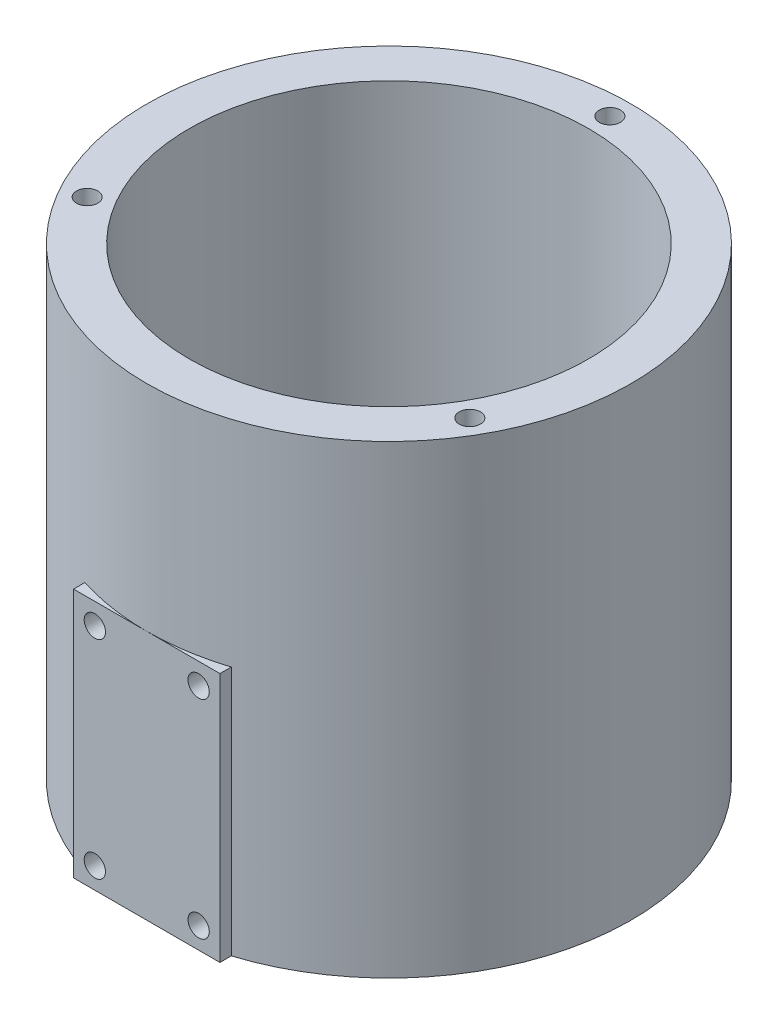
ISO-10303-21;
HEADER;
FILE_DESCRIPTION(('STEP AP214'),'2;1');
FILE_NAME('part.step','',(''),(''),'','','');
FILE_SCHEMA(('AUTOMOTIVE_DESIGN { 1 0 10303 214 1 1 1 1 }'));
ENDSEC;
DATA;
#1=APPLICATION_CONTEXT('core data for automotive mechanical design processes');
#2=APPLICATION_PROTOCOL_DEFINITION('international standard','automotive_design',2000,#1);
#3=PRODUCT_CONTEXT('',#1,'mechanical');
#4=PRODUCT('Part','Part','',(#3));
#5=PRODUCT_RELATED_PRODUCT_CATEGORY('part','',(#4));
#6=PRODUCT_DEFINITION_FORMATION('','',#4);
#7=PRODUCT_DEFINITION_CONTEXT('part definition',#1,'design');
#8=PRODUCT_DEFINITION('design','',#6,#7);
#9=PRODUCT_DEFINITION_SHAPE('','',#8);
#10=(LENGTH_UNIT() NAMED_UNIT(*) SI_UNIT(.MILLI.,.METRE.));
#11=(NAMED_UNIT(*) PLANE_ANGLE_UNIT() SI_UNIT($,.RADIAN.));
#12=(NAMED_UNIT(*) SI_UNIT($,.STERADIAN.) SOLID_ANGLE_UNIT());
#13=UNCERTAINTY_MEASURE_WITH_UNIT(LENGTH_MEASURE(1.E-05),#10,'distance_accuracy_value','');
#14=(GEOMETRIC_REPRESENTATION_CONTEXT(3) GLOBAL_UNCERTAINTY_ASSIGNED_CONTEXT((#13)) GLOBAL_UNIT_ASSIGNED_CONTEXT((#10,
#11,#12)) REPRESENTATION_CONTEXT('',''));
#15=CARTESIAN_POINT('',(0.,0.,0.));
#16=DIRECTION('',(0.,0.,1.));
#17=DIRECTION('',(1.,0.,0.));
#18=AXIS2_PLACEMENT_3D('',#15,#16,#17);
#19=CARTESIAN_POINT('',(0.,4.,0.));
#20=DIRECTION('',(0.,1.,0.));
#21=DIRECTION('',(0.,0.,1.));
#22=AXIS2_PLACEMENT_3D('',#19,#20,#21);
#23=PLANE('',#22);
#24=CARTESIAN_POINT('',(0.,4.,0.));
#25=DIRECTION('',(0.,1.,0.));
#26=DIRECTION('',(0.,0.,1.));
#27=AXIS2_PLACEMENT_3D('',#24,#25,#26);
#28=CIRCLE('',#27,33.5);
#29=CARTESIAN_POINT('',(0.,4.,33.5));
#30=VERTEX_POINT('',#29);
#31=EDGE_CURVE('E52',#30,#30,#28,.T.);
#32=ORIENTED_EDGE('',*,*,#31,.F.);
#33=EDGE_LOOP('',(#32));
#34=FACE_BOUND('',#33,.T.);
#35=CARTESIAN_POINT('',(0.,4.,0.));
#36=DIRECTION('',(0.,1.,0.));
#37=DIRECTION('',(0.,0.,1.));
#38=AXIS2_PLACEMENT_3D('',#35,#36,#37);
#39=CIRCLE('',#38,37.5);
#40=CARTESIAN_POINT('',(0.,4.,37.5));
#41=VERTEX_POINT('',#40);
#42=EDGE_CURVE('E161',#41,#41,#39,.T.);
#43=ORIENTED_EDGE('',*,*,#42,.T.);
#44=EDGE_LOOP('',(#43));
#45=FACE_BOUND('',#44,.T.);
#46=ADVANCED_FACE('F43',(#34,#45),#23,.T.);
#47=CARTESIAN_POINT('',(0.,0.,0.));
#48=DIRECTION('',(0.,1.,0.));
#49=DIRECTION('',(0.,0.,1.));
#50=AXIS2_PLACEMENT_3D('',#47,#48,#49);
#51=PLANE('',#50);
#52=CARTESIAN_POINT('',(0.,0.,0.));
#53=DIRECTION('',(0.,1.,0.));
#54=DIRECTION('',(0.,0.,1.));
#55=AXIS2_PLACEMENT_3D('',#52,#53,#54);
#56=CIRCLE('',#55,45.5);
#57=CARTESIAN_POINT('',(13.75,0.,43.3726584382373));
#58=VERTEX_POINT('',#57);
#59=CARTESIAN_POINT('',(-13.75,0.,43.3726584382373));
#60=VERTEX_POINT('',#59);
#61=EDGE_CURVE('E11',#58,#60,#56,.T.);
#62=ORIENTED_EDGE('',*,*,#61,.F.);
#63=DIRECTION('',(0.,0.,1.));
#64=VECTOR('',#63,1.);
#65=CARTESIAN_POINT('',(13.75,0.,-45.502));
#66=LINE('',#65,#64);
#67=CARTESIAN_POINT('',(13.75,0.,45.5));
#68=VERTEX_POINT('',#67);
#69=EDGE_CURVE('E105',#58,#68,#66,.T.);
#70=ORIENTED_EDGE('',*,*,#69,.T.);
#71=DIRECTION('',(1.,0.,0.));
#72=VECTOR('',#71,1.);
#73=CARTESIAN_POINT('',(-13.75,0.,45.5));
#74=LINE('',#73,#72);
#75=CARTESIAN_POINT('',(-13.75,0.,45.5));
#76=VERTEX_POINT('',#75);
#77=EDGE_CURVE('E131',#76,#68,#74,.T.);
#78=ORIENTED_EDGE('',*,*,#77,.F.);
#79=DIRECTION('',(0.,0.,1.));
#80=VECTOR('',#79,1.);
#81=CARTESIAN_POINT('',(-13.75,0.,-45.502));
#82=LINE('',#81,#80);
#83=EDGE_CURVE('E114',#60,#76,#82,.T.);
#84=ORIENTED_EDGE('',*,*,#83,.F.);
#85=EDGE_LOOP('',(#62,#70,#78,#84));
#86=FACE_BOUND('',#85,.T.);
#87=CARTESIAN_POINT('',(0.,0.,0.));
#88=DIRECTION('',(0.,1.,0.));
#89=DIRECTION('',(0.,0.,1.));
#90=AXIS2_PLACEMENT_3D('',#87,#88,#89);
#91=CIRCLE('',#90,33.5);
#92=CARTESIAN_POINT('',(0.,0.,33.5));
#93=VERTEX_POINT('',#92);
#94=EDGE_CURVE('E176',#93,#93,#91,.T.);
#95=ORIENTED_EDGE('',*,*,#94,.T.);
#96=EDGE_LOOP('',(#95));
#97=FACE_BOUND('',#96,.T.);
#98=ADVANCED_FACE('F183',(#86,#97),#51,.F.);
#99=CARTESIAN_POINT('',(0.,4.,0.));
#100=DIRECTION('',(0.,-1.,0.));
#101=DIRECTION('',(0.,0.,-1.));
#102=AXIS2_PLACEMENT_3D('',#99,#100,#101);
#103=CYLINDRICAL_SURFACE('',#102,45.5);
#104=ORIENTED_EDGE('',*,*,#61,.T.);
#105=DIRECTION('',(0.,-1.,0.));
#106=VECTOR('',#105,1.);
#107=CARTESIAN_POINT('',(-13.75,4.,43.3726584382373));
#108=LINE('',#107,#106);
#109=CARTESIAN_POINT('',(-13.75,47.,43.3726584382373));
#110=VERTEX_POINT('',#109);
#111=EDGE_CURVE('E58',#110,#60,#108,.T.);
#112=ORIENTED_EDGE('',*,*,#111,.F.);
#113=CARTESIAN_POINT('',(0.,47.,0.));
#114=DIRECTION('',(0.,1.,0.));
#115=DIRECTION('',(0.,0.,1.));
#116=AXIS2_PLACEMENT_3D('',#113,#114,#115);
#117=CIRCLE('',#116,45.5);
#118=CARTESIAN_POINT('',(0.,47.,45.5));
#119=VERTEX_POINT('',#118);
#120=EDGE_CURVE('E108',#119,#110,#117,.F.);
#121=ORIENTED_EDGE('',*,*,#120,.F.);
#122=CARTESIAN_POINT('',(0.,47.,0.));
#123=DIRECTION('',(0.,1.,0.));
#124=DIRECTION('',(0.,0.,1.));
#125=AXIS2_PLACEMENT_3D('',#122,#123,#124);
#126=CIRCLE('',#125,45.5);
#127=CARTESIAN_POINT('',(13.75,47.,43.3726584382373));
#128=VERTEX_POINT('',#127);
#129=EDGE_CURVE('E101',#128,#119,#126,.F.);
#130=ORIENTED_EDGE('',*,*,#129,.F.);
#131=DIRECTION('',(0.,-1.,0.));
#132=VECTOR('',#131,1.);
#133=CARTESIAN_POINT('',(13.75,4.,43.3726584382373));
#134=LINE('',#133,#132);
#135=EDGE_CURVE('E106',#58,#128,#134,.F.);
#136=ORIENTED_EDGE('',*,*,#135,.F.);
#137=EDGE_LOOP('',(#104,#112,#121,#130,#136));
#138=FACE_BOUND('',#137,.T.);
#139=CARTESIAN_POINT('',(0.,87.3,0.));
#140=DIRECTION('',(0.,1.,0.));
#141=DIRECTION('',(0.,0.,1.));
#142=AXIS2_PLACEMENT_3D('',#139,#140,#141);
#143=CIRCLE('',#142,45.5);
#144=CARTESIAN_POINT('',(0.,87.3,45.5));
#145=VERTEX_POINT('',#144);
#146=EDGE_CURVE('E169',#145,#145,#143,.T.);
#147=ORIENTED_EDGE('',*,*,#146,.F.);
#148=EDGE_LOOP('',(#147));
#149=FACE_BOUND('',#148,.T.);
#150=ADVANCED_FACE('F45',(#138,#149),#103,.T.);
#151=CARTESIAN_POINT('',(0.,4.,0.));
#152=DIRECTION('',(0.,-1.,0.));
#153=DIRECTION('',(0.,0.,-1.));
#154=AXIS2_PLACEMENT_3D('',#151,#152,#153);
#155=CYLINDRICAL_SURFACE('',#154,33.5);
#156=ORIENTED_EDGE('',*,*,#31,.T.);
#157=EDGE_LOOP('',(#156));
#158=FACE_BOUND('',#157,.T.);
#159=ORIENTED_EDGE('',*,*,#94,.F.);
#160=EDGE_LOOP('',(#159));
#161=FACE_BOUND('',#160,.T.);
#162=ADVANCED_FACE('F185',(#158,#161),#155,.F.);
#163=CARTESIAN_POINT('',(0.,87.3,0.));
#164=DIRECTION('',(0.,1.,0.));
#165=DIRECTION('',(0.,0.,1.));
#166=AXIS2_PLACEMENT_3D('',#163,#164,#165);
#167=PLANE('',#166);
#168=CARTESIAN_POINT('',(-35.9400542570541,87.3,20.7500000000002));
#169=DIRECTION('',(0.,1.,0.));
#170=DIRECTION('',(0.866025403784436,0.,-0.500000000000004));
#171=AXIS2_PLACEMENT_3D('',#168,#169,#170);
#172=CIRCLE('',#171,2.);
#173=CARTESIAN_POINT('',(-34.2080034494852,87.3,19.7500000000002));
#174=VERTEX_POINT('',#173);
#175=EDGE_CURVE('E146',#174,#174,#172,.T.);
#176=ORIENTED_EDGE('',*,*,#175,.F.);
#177=EDGE_LOOP('',(#176));
#178=FACE_BOUND('',#177,.T.);
#179=CARTESIAN_POINT('',(35.9400542570544,87.3,20.7499999999997));
#180=DIRECTION('',(0.,1.,0.));
#181=DIRECTION('',(-0.866025403784443,0.,-0.499999999999992));
#182=AXIS2_PLACEMENT_3D('',#179,#180,#181);
#183=CIRCLE('',#182,2.);
#184=CARTESIAN_POINT('',(34.2080034494855,87.3,19.7499999999997));
#185=VERTEX_POINT('',#184);
#186=EDGE_CURVE('E136',#185,#185,#183,.T.);
#187=ORIENTED_EDGE('',*,*,#186,.F.);
#188=EDGE_LOOP('',(#187));
#189=FACE_BOUND('',#188,.T.);
#190=CARTESIAN_POINT('',(0.,87.3,-41.5));
#191=DIRECTION('',(0.,1.,0.));
#192=DIRECTION('',(0.,0.,1.));
#193=AXIS2_PLACEMENT_3D('',#190,#191,#192);
#194=CIRCLE('',#193,2.);
#195=CARTESIAN_POINT('',(0.,87.3,-39.5));
#196=VERTEX_POINT('',#195);
#197=EDGE_CURVE('E145',#196,#196,#194,.T.);
#198=ORIENTED_EDGE('',*,*,#197,.F.);
#199=EDGE_LOOP('',(#198));
#200=FACE_BOUND('',#199,.T.);
#201=ORIENTED_EDGE('',*,*,#146,.T.);
#202=EDGE_LOOP('',(#201));
#203=FACE_BOUND('',#202,.T.);
#204=CARTESIAN_POINT('',(0.,87.3,0.));
#205=DIRECTION('',(0.,1.,0.));
#206=DIRECTION('',(0.,0.,1.));
#207=AXIS2_PLACEMENT_3D('',#204,#205,#206);
#208=CIRCLE('',#207,37.5);
#209=CARTESIAN_POINT('',(0.,87.3,37.5));
#210=VERTEX_POINT('',#209);
#211=EDGE_CURVE('E165',#210,#210,#208,.T.);
#212=ORIENTED_EDGE('',*,*,#211,.F.);
#213=EDGE_LOOP('',(#212));
#214=FACE_BOUND('',#213,.T.);
#215=ADVANCED_FACE('F187',(#178,#189,#200,#203,#214),#167,.T.);
#216=CARTESIAN_POINT('',(0.,87.3,0.));
#217=DIRECTION('',(0.,-1.,0.));
#218=DIRECTION('',(0.,0.,-1.));
#219=AXIS2_PLACEMENT_3D('',#216,#217,#218);
#220=CYLINDRICAL_SURFACE('',#219,37.5);
#221=ORIENTED_EDGE('',*,*,#211,.T.);
#222=EDGE_LOOP('',(#221));
#223=FACE_BOUND('',#222,.T.);
#224=ORIENTED_EDGE('',*,*,#42,.F.);
#225=EDGE_LOOP('',(#224));
#226=FACE_BOUND('',#225,.T.);
#227=ADVANCED_FACE('F194',(#223,#226),#220,.F.);
#228=CARTESIAN_POINT('',(0.,81.3,-41.5));
#229=DIRECTION('',(0.,1.,0.));
#230=DIRECTION('',(0.,0.,1.));
#231=AXIS2_PLACEMENT_3D('',#228,#229,#230);
#232=CYLINDRICAL_SURFACE('',#231,2.);
#233=CARTESIAN_POINT('',(0.,81.3,-41.5));
#234=DIRECTION('',(0.,1.,0.));
#235=DIRECTION('',(0.,0.,1.));
#236=AXIS2_PLACEMENT_3D('',#233,#234,#235);
#237=CIRCLE('',#236,2.);
#238=CARTESIAN_POINT('',(0.,81.3,-39.5));
#239=VERTEX_POINT('',#238);
#240=EDGE_CURVE('E157',#239,#239,#237,.T.);
#241=ORIENTED_EDGE('',*,*,#240,.F.);
#242=EDGE_LOOP('',(#241));
#243=FACE_BOUND('',#242,.T.);
#244=ORIENTED_EDGE('',*,*,#197,.T.);
#245=EDGE_LOOP('',(#244));
#246=FACE_BOUND('',#245,.T.);
#247=ADVANCED_FACE('F209',(#243,#246),#232,.F.);
#248=CARTESIAN_POINT('',(0.,81.3,-41.5));
#249=DIRECTION('',(0.,1.,0.));
#250=DIRECTION('',(0.,0.,1.));
#251=AXIS2_PLACEMENT_3D('',#248,#249,#250);
#252=PLANE('',#251);
#253=ORIENTED_EDGE('',*,*,#240,.T.);
#254=EDGE_LOOP('',(#253));
#255=FACE_BOUND('',#254,.T.);
#256=ADVANCED_FACE('F215',(#255),#252,.T.);
#257=CARTESIAN_POINT('',(35.9400542570544,81.3,20.7499999999997));
#258=DIRECTION('',(0.,1.,0.));
#259=DIRECTION('',(0.,0.,1.));
#260=AXIS2_PLACEMENT_3D('',#257,#258,#259);
#261=CYLINDRICAL_SURFACE('',#260,2.);
#262=CARTESIAN_POINT('',(35.9400542570544,81.3,20.7499999999997));
#263=DIRECTION('',(0.,1.,0.));
#264=DIRECTION('',(-0.866025403784443,0.,-0.499999999999992));
#265=AXIS2_PLACEMENT_3D('',#262,#263,#264);
#266=CIRCLE('',#265,2.);
#267=CARTESIAN_POINT('',(34.2080034494855,81.3,19.7499999999997));
#268=VERTEX_POINT('',#267);
#269=EDGE_CURVE('E150',#268,#268,#266,.T.);
#270=ORIENTED_EDGE('',*,*,#269,.F.);
#271=EDGE_LOOP('',(#270));
#272=FACE_BOUND('',#271,.T.);
#273=ORIENTED_EDGE('',*,*,#186,.T.);
#274=EDGE_LOOP('',(#273));
#275=FACE_BOUND('',#274,.T.);
#276=ADVANCED_FACE('F221',(#272,#275),#261,.F.);
#277=CARTESIAN_POINT('',(35.9400542570544,81.3,20.7499999999997));
#278=DIRECTION('',(0.,1.,0.));
#279=DIRECTION('',(-0.866025403784443,0.,-0.499999999999992));
#280=AXIS2_PLACEMENT_3D('',#277,#278,#279);
#281=PLANE('',#280);
#282=ORIENTED_EDGE('',*,*,#269,.T.);
#283=EDGE_LOOP('',(#282));
#284=FACE_BOUND('',#283,.T.);
#285=ADVANCED_FACE('F225',(#284),#281,.T.);
#286=CARTESIAN_POINT('',(-35.9400542570541,81.3,20.7500000000002));
#287=DIRECTION('',(0.,1.,0.));
#288=DIRECTION('',(0.,0.,1.));
#289=AXIS2_PLACEMENT_3D('',#286,#287,#288);
#290=CYLINDRICAL_SURFACE('',#289,2.);
#291=CARTESIAN_POINT('',(-35.9400542570541,81.3,20.7500000000002));
#292=DIRECTION('',(0.,1.,0.));
#293=DIRECTION('',(0.866025403784436,0.,-0.500000000000004));
#294=AXIS2_PLACEMENT_3D('',#291,#292,#293);
#295=CIRCLE('',#294,2.);
#296=CARTESIAN_POINT('',(-34.2080034494852,81.3,19.7500000000002));
#297=VERTEX_POINT('',#296);
#298=EDGE_CURVE('E141',#297,#297,#295,.T.);
#299=ORIENTED_EDGE('',*,*,#298,.F.);
#300=EDGE_LOOP('',(#299));
#301=FACE_BOUND('',#300,.T.);
#302=ORIENTED_EDGE('',*,*,#175,.T.);
#303=EDGE_LOOP('',(#302));
#304=FACE_BOUND('',#303,.T.);
#305=ADVANCED_FACE('F229',(#301,#304),#290,.F.);
#306=CARTESIAN_POINT('',(-35.9400542570541,81.3,20.7500000000002));
#307=DIRECTION('',(0.,1.,0.));
#308=DIRECTION('',(0.866025403784436,0.,-0.500000000000004));
#309=AXIS2_PLACEMENT_3D('',#306,#307,#308);
#310=PLANE('',#309);
#311=ORIENTED_EDGE('',*,*,#298,.T.);
#312=EDGE_LOOP('',(#311));
#313=FACE_BOUND('',#312,.T.);
#314=ADVANCED_FACE('F233',(#313),#310,.T.);
#315=CARTESIAN_POINT('',(13.75,47.,-45.502));
#316=DIRECTION('',(0.,1.,0.));
#317=DIRECTION('',(0.,0.,1.));
#318=AXIS2_PLACEMENT_3D('',#315,#316,#317);
#319=PLANE('',#318);
#320=DIRECTION('',(0.,0.,1.));
#321=VECTOR('',#320,1.);
#322=CARTESIAN_POINT('',(13.75,47.,-45.502));
#323=LINE('',#322,#321);
#324=CARTESIAN_POINT('',(13.75,47.,45.5));
#325=VERTEX_POINT('',#324);
#326=EDGE_CURVE('E99',#128,#325,#323,.T.);
#327=ORIENTED_EDGE('',*,*,#326,.F.);
#328=ORIENTED_EDGE('',*,*,#129,.T.);
#329=DIRECTION('',(-1.,0.,0.));
#330=VECTOR('',#329,1.);
#331=CARTESIAN_POINT('',(13.75,47.,45.5));
#332=LINE('',#331,#330);
#333=EDGE_CURVE('E86',#325,#119,#332,.T.);
#334=ORIENTED_EDGE('',*,*,#333,.F.);
#335=EDGE_LOOP('',(#327,#328,#334));
#336=FACE_BOUND('',#335,.T.);
#337=ADVANCED_FACE('F102',(#336),#319,.T.);
#338=CARTESIAN_POINT('',(13.75,0.,-45.502));
#339=DIRECTION('',(1.,0.,0.));
#340=DIRECTION('',(0.,0.,-1.));
#341=AXIS2_PLACEMENT_3D('',#338,#339,#340);
#342=PLANE('',#341);
#343=ORIENTED_EDGE('',*,*,#69,.F.);
#344=ORIENTED_EDGE('',*,*,#135,.T.);
#345=ORIENTED_EDGE('',*,*,#326,.T.);
#346=DIRECTION('',(0.,1.,0.));
#347=VECTOR('',#346,1.);
#348=CARTESIAN_POINT('',(13.75,0.,45.5));
#349=LINE('',#348,#347);
#350=EDGE_CURVE('E95',#68,#325,#349,.T.);
#351=ORIENTED_EDGE('',*,*,#350,.F.);
#352=EDGE_LOOP('',(#343,#344,#345,#351));
#353=FACE_BOUND('',#352,.T.);
#354=ADVANCED_FACE('F238',(#353),#342,.T.);
#355=CARTESIAN_POINT('',(0.,0.,45.5));
#356=DIRECTION('',(0.,0.,1.));
#357=DIRECTION('',(1.,0.,0.));
#358=AXIS2_PLACEMENT_3D('',#355,#356,#357);
#359=PLANE('',#358);
#360=CARTESIAN_POINT('',(-9.75,43.,45.5));
#361=DIRECTION('',(0.,0.,1.));
#362=DIRECTION('',(1.,0.,0.));
#363=AXIS2_PLACEMENT_3D('',#360,#361,#362);
#364=CIRCLE('',#363,2.);
#365=CARTESIAN_POINT('',(-7.75,43.,45.5));
#366=VERTEX_POINT('',#365);
#367=EDGE_CURVE('E291',#366,#366,#364,.T.);
#368=ORIENTED_EDGE('',*,*,#367,.F.);
#369=EDGE_LOOP('',(#368));
#370=FACE_BOUND('',#369,.T.);
#371=CARTESIAN_POINT('',(9.75000000000001,43.,45.5));
#372=DIRECTION('',(0.,0.,1.));
#373=DIRECTION('',(1.,0.,0.));
#374=AXIS2_PLACEMENT_3D('',#371,#372,#373);
#375=CIRCLE('',#374,2.);
#376=CARTESIAN_POINT('',(11.75,43.,45.5));
#377=VERTEX_POINT('',#376);
#378=EDGE_CURVE('E305',#377,#377,#375,.T.);
#379=ORIENTED_EDGE('',*,*,#378,.F.);
#380=EDGE_LOOP('',(#379));
#381=FACE_BOUND('',#380,.T.);
#382=CARTESIAN_POINT('',(-9.75,4.,45.5));
#383=DIRECTION('',(0.,0.,1.));
#384=DIRECTION('',(1.,0.,0.));
#385=AXIS2_PLACEMENT_3D('',#382,#383,#384);
#386=CIRCLE('',#385,2.);
#387=CARTESIAN_POINT('',(-7.75,4.,45.5));
#388=VERTEX_POINT('',#387);
#389=EDGE_CURVE('E313',#388,#388,#386,.T.);
#390=ORIENTED_EDGE('',*,*,#389,.F.);
#391=EDGE_LOOP('',(#390));
#392=FACE_BOUND('',#391,.T.);
#393=CARTESIAN_POINT('',(9.75,4.,45.5));
#394=DIRECTION('',(0.,0.,1.));
#395=DIRECTION('',(1.,0.,0.));
#396=AXIS2_PLACEMENT_3D('',#393,#394,#395);
#397=CIRCLE('',#396,2.);
#398=CARTESIAN_POINT('',(11.75,4.,45.5));
#399=VERTEX_POINT('',#398);
#400=EDGE_CURVE('E290',#399,#399,#397,.T.);
#401=ORIENTED_EDGE('',*,*,#400,.F.);
#402=EDGE_LOOP('',(#401));
#403=FACE_BOUND('',#402,.T.);
#404=ORIENTED_EDGE('',*,*,#333,.T.);
#405=DIRECTION('',(-1.,0.,0.));
#406=VECTOR('',#405,1.);
#407=CARTESIAN_POINT('',(13.75,47.,45.5));
#408=LINE('',#407,#406);
#409=CARTESIAN_POINT('',(-13.75,47.,45.5));
#410=VERTEX_POINT('',#409);
#411=EDGE_CURVE('E91',#119,#410,#408,.T.);
#412=ORIENTED_EDGE('',*,*,#411,.T.);
#413=DIRECTION('',(0.,-1.,0.));
#414=VECTOR('',#413,1.);
#415=CARTESIAN_POINT('',(-13.75,47.,45.5));
#416=LINE('',#415,#414);
#417=EDGE_CURVE('E118',#410,#76,#416,.T.);
#418=ORIENTED_EDGE('',*,*,#417,.T.);
#419=ORIENTED_EDGE('',*,*,#77,.T.);
#420=ORIENTED_EDGE('',*,*,#350,.T.);
#421=EDGE_LOOP('',(#404,#412,#418,#419,#420));
#422=FACE_BOUND('',#421,.T.);
#423=ADVANCED_FACE('F88',(#370,#381,#392,#403,#422),#359,.T.);
#424=CARTESIAN_POINT('',(-13.75,47.,-45.502));
#425=DIRECTION('',(-1.,0.,0.));
#426=DIRECTION('',(0.,-1.,0.));
#427=AXIS2_PLACEMENT_3D('',#424,#425,#426);
#428=PLANE('',#427);
#429=DIRECTION('',(0.,0.,1.));
#430=VECTOR('',#429,1.);
#431=CARTESIAN_POINT('',(-13.75,47.,-45.502));
#432=LINE('',#431,#430);
#433=EDGE_CURVE('E113',#110,#410,#432,.T.);
#434=ORIENTED_EDGE('',*,*,#433,.F.);
#435=ORIENTED_EDGE('',*,*,#111,.T.);
#436=ORIENTED_EDGE('',*,*,#83,.T.);
#437=ORIENTED_EDGE('',*,*,#417,.F.);
#438=EDGE_LOOP('',(#434,#435,#436,#437));
#439=FACE_BOUND('',#438,.T.);
#440=ADVANCED_FACE('F246',(#439),#428,.T.);
#441=CARTESIAN_POINT('',(13.75,47.,-45.502));
#442=DIRECTION('',(0.,1.,0.));
#443=DIRECTION('',(0.,0.,1.));
#444=AXIS2_PLACEMENT_3D('',#441,#442,#443);
#445=PLANE('',#444);
#446=ORIENTED_EDGE('',*,*,#411,.F.);
#447=ORIENTED_EDGE('',*,*,#120,.T.);
#448=ORIENTED_EDGE('',*,*,#433,.T.);
#449=EDGE_LOOP('',(#446,#447,#448));
#450=FACE_BOUND('',#449,.T.);
#451=ADVANCED_FACE('F116',(#450),#445,.T.);
#452=CARTESIAN_POINT('',(9.75,4.,39.5));
#453=DIRECTION('',(0.,0.,1.));
#454=DIRECTION('',(1.,0.,0.));
#455=AXIS2_PLACEMENT_3D('',#452,#453,#454);
#456=CYLINDRICAL_SURFACE('',#455,2.);
#457=CARTESIAN_POINT('',(9.75,4.,39.5));
#458=DIRECTION('',(0.,0.,1.));
#459=DIRECTION('',(1.,0.,0.));
#460=AXIS2_PLACEMENT_3D('',#457,#458,#459);
#461=CIRCLE('',#460,2.);
#462=CARTESIAN_POINT('',(11.75,4.,39.5));
#463=VERTEX_POINT('',#462);
#464=EDGE_CURVE('E296',#463,#463,#461,.T.);
#465=ORIENTED_EDGE('',*,*,#464,.F.);
#466=EDGE_LOOP('',(#465));
#467=FACE_BOUND('',#466,.T.);
#468=ORIENTED_EDGE('',*,*,#400,.T.);
#469=EDGE_LOOP('',(#468));
#470=FACE_BOUND('',#469,.T.);
#471=ADVANCED_FACE('F250',(#467,#470),#456,.F.);
#472=CARTESIAN_POINT('',(9.75,4.,39.5));
#473=DIRECTION('',(0.,0.,1.));
#474=DIRECTION('',(1.,0.,0.));
#475=AXIS2_PLACEMENT_3D('',#472,#473,#474);
#476=PLANE('',#475);
#477=ORIENTED_EDGE('',*,*,#464,.T.);
#478=EDGE_LOOP('',(#477));
#479=FACE_BOUND('',#478,.T.);
#480=ADVANCED_FACE('F256',(#479),#476,.T.);
#481=CARTESIAN_POINT('',(-9.75,4.,39.5));
#482=DIRECTION('',(0.,0.,1.));
#483=DIRECTION('',(1.,0.,0.));
#484=AXIS2_PLACEMENT_3D('',#481,#482,#483);
#485=CYLINDRICAL_SURFACE('',#484,2.);
#486=CARTESIAN_POINT('',(-9.75,4.,39.5));
#487=DIRECTION('',(0.,0.,1.));
#488=DIRECTION('',(1.,0.,0.));
#489=AXIS2_PLACEMENT_3D('',#486,#487,#488);
#490=CIRCLE('',#489,2.);
#491=CARTESIAN_POINT('',(-7.75,4.,39.5));
#492=VERTEX_POINT('',#491);
#493=EDGE_CURVE('E309',#492,#492,#490,.T.);
#494=ORIENTED_EDGE('',*,*,#493,.F.);
#495=EDGE_LOOP('',(#494));
#496=FACE_BOUND('',#495,.T.);
#497=ORIENTED_EDGE('',*,*,#389,.T.);
#498=EDGE_LOOP('',(#497));
#499=FACE_BOUND('',#498,.T.);
#500=ADVANCED_FACE('F260',(#496,#499),#485,.F.);
#501=CARTESIAN_POINT('',(-9.75,4.,39.5));
#502=DIRECTION('',(0.,0.,1.));
#503=DIRECTION('',(1.,0.,0.));
#504=AXIS2_PLACEMENT_3D('',#501,#502,#503);
#505=PLANE('',#504);
#506=ORIENTED_EDGE('',*,*,#493,.T.);
#507=EDGE_LOOP('',(#506));
#508=FACE_BOUND('',#507,.T.);
#509=ADVANCED_FACE('F264',(#508),#505,.T.);
#510=CARTESIAN_POINT('',(9.75000000000001,43.,39.5));
#511=DIRECTION('',(0.,0.,1.));
#512=DIRECTION('',(1.,0.,0.));
#513=AXIS2_PLACEMENT_3D('',#510,#511,#512);
#514=CYLINDRICAL_SURFACE('',#513,2.);
#515=CARTESIAN_POINT('',(9.75000000000001,43.,39.5));
#516=DIRECTION('',(0.,0.,1.));
#517=DIRECTION('',(1.,0.,0.));
#518=AXIS2_PLACEMENT_3D('',#515,#516,#517);
#519=CIRCLE('',#518,2.);
#520=CARTESIAN_POINT('',(11.75,43.,39.5));
#521=VERTEX_POINT('',#520);
#522=EDGE_CURVE('E299',#521,#521,#519,.T.);
#523=ORIENTED_EDGE('',*,*,#522,.F.);
#524=EDGE_LOOP('',(#523));
#525=FACE_BOUND('',#524,.T.);
#526=ORIENTED_EDGE('',*,*,#378,.T.);
#527=EDGE_LOOP('',(#526));
#528=FACE_BOUND('',#527,.T.);
#529=ADVANCED_FACE('F268',(#525,#528),#514,.F.);
#530=CARTESIAN_POINT('',(0.,0.,39.5));
#531=DIRECTION('',(0.,0.,1.));
#532=DIRECTION('',(1.,0.,0.));
#533=AXIS2_PLACEMENT_3D('',#530,#531,#532);
#534=PLANE('',#533);
#535=ORIENTED_EDGE('',*,*,#522,.T.);
#536=EDGE_LOOP('',(#535));
#537=FACE_BOUND('',#536,.T.);
#538=ADVANCED_FACE('F272',(#537),#534,.T.);
#539=CARTESIAN_POINT('',(-9.75,43.,39.5));
#540=DIRECTION('',(0.,0.,1.));
#541=DIRECTION('',(1.,0.,0.));
#542=AXIS2_PLACEMENT_3D('',#539,#540,#541);
#543=CYLINDRICAL_SURFACE('',#542,2.);
#544=CARTESIAN_POINT('',(-9.75,43.,39.5));
#545=DIRECTION('',(0.,0.,1.));
#546=DIRECTION('',(1.,0.,0.));
#547=AXIS2_PLACEMENT_3D('',#544,#545,#546);
#548=CIRCLE('',#547,2.);
#549=CARTESIAN_POINT('',(-7.75,43.,39.5));
#550=VERTEX_POINT('',#549);
#551=EDGE_CURVE('E288',#550,#550,#548,.T.);
#552=ORIENTED_EDGE('',*,*,#551,.F.);
#553=EDGE_LOOP('',(#552));
#554=FACE_BOUND('',#553,.T.);
#555=ORIENTED_EDGE('',*,*,#367,.T.);
#556=EDGE_LOOP('',(#555));
#557=FACE_BOUND('',#556,.T.);
#558=ADVANCED_FACE('F276',(#554,#557),#543,.F.);
#559=CARTESIAN_POINT('',(0.,0.,39.5));
#560=DIRECTION('',(0.,0.,1.));
#561=DIRECTION('',(1.,0.,0.));
#562=AXIS2_PLACEMENT_3D('',#559,#560,#561);
#563=PLANE('',#562);
#564=ORIENTED_EDGE('',*,*,#551,.T.);
#565=EDGE_LOOP('',(#564));
#566=FACE_BOUND('',#565,.T.);
#567=ADVANCED_FACE('F280',(#566),#563,.T.);
#568=CLOSED_SHELL('',(#46,#98,#150,#162,#215,#227,#247,#256,#276,#285,#305,#314,#337,#354,#423,
#440,#451,#471,#480,#500,#509,#529,#538,#558,#567));
#569=MANIFOLD_SOLID_BREP('B2',#568);
#570=ADVANCED_BREP_SHAPE_REPRESENTATION('',(#18,#569),#14);
#571=SHAPE_DEFINITION_REPRESENTATION(#9,#570);
ENDSEC;
END-ISO-10303-21;
